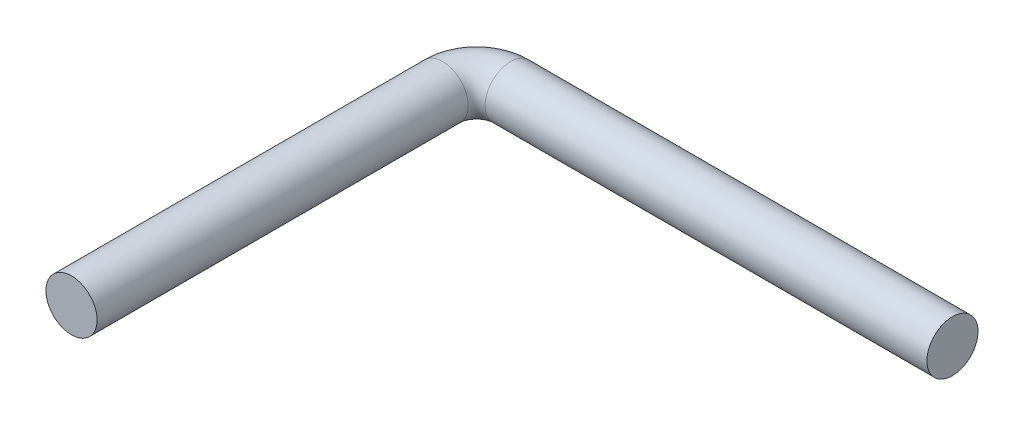
ISO-10303-21;
HEADER;
FILE_DESCRIPTION(('STEP AP214'),'2;1');
FILE_NAME('part.step','',(''),(''),'','','');
FILE_SCHEMA(('AUTOMOTIVE_DESIGN { 1 0 10303 214 1 1 1 1 }'));
ENDSEC;
DATA;
#1=APPLICATION_CONTEXT('core data for automotive mechanical design processes');
#2=APPLICATION_PROTOCOL_DEFINITION('international standard','automotive_design',2000,#1);
#3=PRODUCT_CONTEXT('',#1,'mechanical');
#4=PRODUCT('Part','Part','',(#3));
#5=PRODUCT_RELATED_PRODUCT_CATEGORY('part','',(#4));
#6=PRODUCT_DEFINITION_FORMATION('','',#4);
#7=PRODUCT_DEFINITION_CONTEXT('part definition',#1,'design');
#8=PRODUCT_DEFINITION('design','',#6,#7);
#9=PRODUCT_DEFINITION_SHAPE('','',#8);
#10=(LENGTH_UNIT() NAMED_UNIT(*) SI_UNIT(.MILLI.,.METRE.));
#11=(NAMED_UNIT(*) PLANE_ANGLE_UNIT() SI_UNIT($,.RADIAN.));
#12=(NAMED_UNIT(*) SI_UNIT($,.STERADIAN.) SOLID_ANGLE_UNIT());
#13=UNCERTAINTY_MEASURE_WITH_UNIT(LENGTH_MEASURE(1.E-05),#10,'distance_accuracy_value','');
#14=(GEOMETRIC_REPRESENTATION_CONTEXT(3) GLOBAL_UNCERTAINTY_ASSIGNED_CONTEXT((#13)) GLOBAL_UNIT_ASSIGNED_CONTEXT((#10,
#11,#12)) REPRESENTATION_CONTEXT('',''));
#15=CARTESIAN_POINT('',(0.,0.,0.));
#16=DIRECTION('',(0.,0.,1.));
#17=DIRECTION('',(1.,0.,0.));
#18=AXIS2_PLACEMENT_3D('',#15,#16,#17);
#19=CARTESIAN_POINT('',(0.228600000000002,54.356,4.826));
#20=DIRECTION('',(1.,0.,0.));
#21=DIRECTION('',(0.,0.,-1.));
#22=AXIS2_PLACEMENT_3D('',#19,#20,#21);
#23=CYLINDRICAL_SURFACE('',#22,2.3876);
#24=CARTESIAN_POINT('',(0.228600000000002,54.356,4.826));
#25=DIRECTION('',(-1.,0.,0.));
#26=DIRECTION('',(0.,0.,1.));
#27=AXIS2_PLACEMENT_3D('',#24,#25,#26);
#28=CIRCLE('',#27,2.3876);
#29=CARTESIAN_POINT('',(0.228600000000004,54.356,2.4384));
#30=VERTEX_POINT('',#29);
#31=EDGE_CURVE('E22',#30,#30,#28,.T.);
#32=ORIENTED_EDGE('',*,*,#31,.F.);
#33=EDGE_LOOP('',(#32));
#34=FACE_BOUND('',#33,.T.);
#35=CARTESIAN_POINT('',(41.5036,54.356,4.826));
#36=DIRECTION('',(-1.,0.,0.));
#37=DIRECTION('',(0.,0.,1.));
#38=AXIS2_PLACEMENT_3D('',#35,#36,#37);
#39=CIRCLE('',#38,2.3876);
#40=CARTESIAN_POINT('',(41.5036,54.356,7.2136));
#41=VERTEX_POINT('',#40);
#42=EDGE_CURVE('E10',#41,#41,#39,.T.);
#43=ORIENTED_EDGE('',*,*,#42,.T.);
#44=EDGE_LOOP('',(#43));
#45=FACE_BOUND('',#44,.T.);
#46=ADVANCED_FACE('F15',(#34,#45),#23,.T.);
#47=CARTESIAN_POINT('',(0.2286,54.356,8.001));
#48=DIRECTION('',(0.,-1.,0.));
#49=DIRECTION('',(0.,0.,-1.));
#50=AXIS2_PLACEMENT_3D('',#47,#48,#49);
#51=TOROIDAL_SURFACE('',#50,3.175,2.3876);
#52=CARTESIAN_POINT('',(-2.9464,54.356,8.001));
#53=DIRECTION('',(0.,0.,1.));
#54=DIRECTION('',(1.,0.,0.));
#55=AXIS2_PLACEMENT_3D('',#52,#53,#54);
#56=CIRCLE('',#55,2.3876);
#57=CARTESIAN_POINT('',(-5.334,54.356,8.001));
#58=VERTEX_POINT('',#57);
#59=EDGE_CURVE('E29',#58,#58,#56,.T.);
#60=CARTESIAN_POINT('',(0.2286,54.356,8.001));
#61=DIRECTION('',(0.,-1.,0.));
#62=DIRECTION('',(0.,0.,-1.));
#63=AXIS2_PLACEMENT_3D('',#60,#61,#62);
#64=CIRCLE('',#63,5.5626);
#65=EDGE_CURVE('',#58,#30,#64,.T.);
#66=ORIENTED_EDGE('',*,*,#59,.F.);
#67=ORIENTED_EDGE('',*,*,#31,.T.);
#68=ORIENTED_EDGE('',*,*,#65,.T.);
#69=ORIENTED_EDGE('',*,*,#65,.F.);
#70=EDGE_LOOP('',(#66,#68,#67,#69));
#71=FACE_BOUND('',#70,.T.);
#72=ADVANCED_FACE('F49',(#71),#51,.T.);
#73=CARTESIAN_POINT('',(-2.9464,54.356,8.001));
#74=DIRECTION('',(0.,0.,1.));
#75=DIRECTION('',(1.,0.,0.));
#76=AXIS2_PLACEMENT_3D('',#73,#74,#75);
#77=CYLINDRICAL_SURFACE('',#76,2.3876);
#78=ORIENTED_EDGE('',*,*,#59,.T.);
#79=EDGE_LOOP('',(#78));
#80=FACE_BOUND('',#79,.T.);
#81=CARTESIAN_POINT('',(-2.9464,54.356,42.672));
#82=DIRECTION('',(0.,0.,1.));
#83=DIRECTION('',(1.,0.,0.));
#84=AXIS2_PLACEMENT_3D('',#81,#82,#83);
#85=CIRCLE('',#84,2.3876);
#86=CARTESIAN_POINT('',(-0.5588,54.356,42.672));
#87=VERTEX_POINT('',#86);
#88=EDGE_CURVE('E35',#87,#87,#85,.T.);
#89=ORIENTED_EDGE('',*,*,#88,.F.);
#90=EDGE_LOOP('',(#89));
#91=FACE_BOUND('',#90,.T.);
#92=ADVANCED_FACE('F46',(#80,#91),#77,.T.);
#93=CARTESIAN_POINT('',(41.5036,54.356,4.826));
#94=DIRECTION('',(-1.,0.,0.));
#95=DIRECTION('',(0.,0.,1.));
#96=AXIS2_PLACEMENT_3D('',#93,#94,#95);
#97=PLANE('',#96);
#98=ORIENTED_EDGE('',*,*,#42,.F.);
#99=EDGE_LOOP('',(#98));
#100=FACE_BOUND('',#99,.T.);
#101=ADVANCED_FACE('F48',(#100),#97,.F.);
#102=CARTESIAN_POINT('',(-2.9464,54.356,42.672));
#103=DIRECTION('',(0.,0.,1.));
#104=DIRECTION('',(1.,0.,0.));
#105=AXIS2_PLACEMENT_3D('',#102,#103,#104);
#106=PLANE('',#105);
#107=ORIENTED_EDGE('',*,*,#88,.T.);
#108=EDGE_LOOP('',(#107));
#109=FACE_BOUND('',#108,.T.);
#110=ADVANCED_FACE('F44',(#109),#106,.T.);
#111=CLOSED_SHELL('',(#46,#72,#92,#101,#110));
#112=MANIFOLD_SOLID_BREP('B1',#111);
#113=ADVANCED_BREP_SHAPE_REPRESENTATION('',(#18,#112),#14);
#114=SHAPE_DEFINITION_REPRESENTATION(#9,#113);
ENDSEC;
END-ISO-10303-21;
